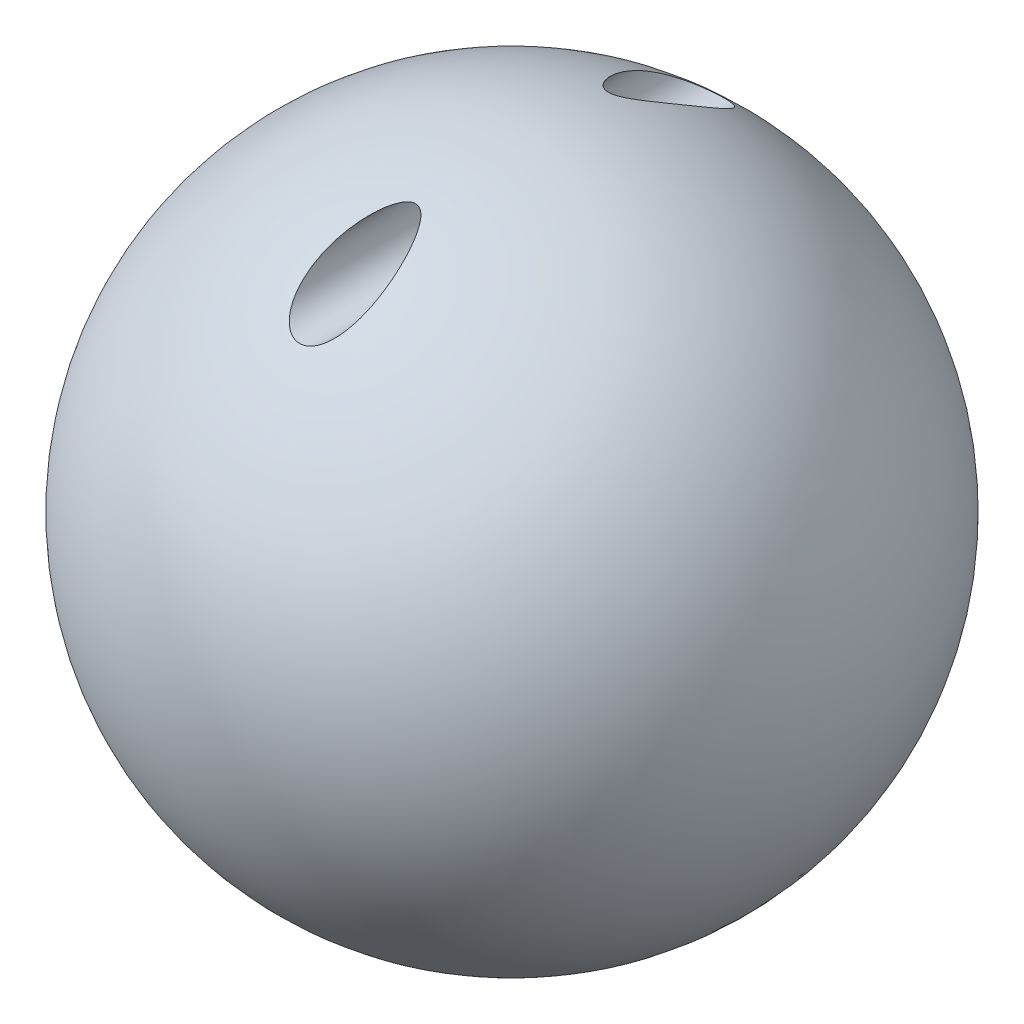
ISO-10303-21;
HEADER;
FILE_DESCRIPTION(('STEP AP214'),'2;1');
FILE_NAME('part.step','',(''),(''),'','','');
FILE_SCHEMA(('AUTOMOTIVE_DESIGN { 1 0 10303 214 1 1 1 1 }'));
ENDSEC;
DATA;
#1=APPLICATION_CONTEXT('core data for automotive mechanical design processes');
#2=APPLICATION_PROTOCOL_DEFINITION('international standard','automotive_design',2000,#1);
#3=PRODUCT_CONTEXT('',#1,'mechanical');
#4=PRODUCT('Part','Part','',(#3));
#5=PRODUCT_RELATED_PRODUCT_CATEGORY('part','',(#4));
#6=PRODUCT_DEFINITION_FORMATION('','',#4);
#7=PRODUCT_DEFINITION_CONTEXT('part definition',#1,'design');
#8=PRODUCT_DEFINITION('design','',#6,#7);
#9=PRODUCT_DEFINITION_SHAPE('','',#8);
#10=(LENGTH_UNIT() NAMED_UNIT(*) SI_UNIT(.MILLI.,.METRE.));
#11=(NAMED_UNIT(*) PLANE_ANGLE_UNIT() SI_UNIT($,.RADIAN.));
#12=(NAMED_UNIT(*) SI_UNIT($,.STERADIAN.) SOLID_ANGLE_UNIT());
#13=UNCERTAINTY_MEASURE_WITH_UNIT(LENGTH_MEASURE(1.E-05),#10,'distance_accuracy_value','');
#14=(GEOMETRIC_REPRESENTATION_CONTEXT(3) GLOBAL_UNCERTAINTY_ASSIGNED_CONTEXT((#13)) GLOBAL_UNIT_ASSIGNED_CONTEXT((#10,
#11,#12)) REPRESENTATION_CONTEXT('',''));
#15=CARTESIAN_POINT('',(0.,0.,0.));
#16=DIRECTION('',(0.,0.,1.));
#17=DIRECTION('',(1.,0.,0.));
#18=AXIS2_PLACEMENT_3D('',#15,#16,#17);
#19=CARTESIAN_POINT('',(0.,25.4,0.));
#20=DIRECTION('',(0.,-1.,0.));
#21=DIRECTION('',(-1.,0.,0.));
#22=AXIS2_PLACEMENT_3D('',#19,#20,#21);
#23=SPHERICAL_SURFACE('',#22,25.4);
#24=CARTESIAN_POINT('',(-1.22120269188826,45.1554710676395,-15.9182280292139));
#25=CARTESIAN_POINT('',(-1.29504889668407,45.1983675774323,-15.8593255572624));
#26=CARTESIAN_POINT('',(-1.36432660117678,45.2438049576575,-15.7966059746381));
#27=CARTESIAN_POINT('',(-1.49438026852856,45.3383211899476,-15.6652794467856));
#28=CARTESIAN_POINT('',(-1.55514590362782,45.3874043569072,-15.5966655098914));
#29=CARTESIAN_POINT('',(-1.66906555937857,45.4883022533573,-15.4546178828212));
#30=CARTESIAN_POINT('',(-1.72218262271763,45.5401286926444,-15.3811631369449));
#31=CARTESIAN_POINT('',(-1.82116586845447,45.645458786848,-15.2307463985294));
#32=CARTESIAN_POINT('',(-1.86703404513156,45.6989619755942,-15.1537853781523));
#33=CARTESIAN_POINT('',(-1.9720866919638,45.8322748420578,-14.9604946034897));
#34=CARTESIAN_POINT('',(-2.02750103824165,45.9127128211485,-14.8425480282001));
#35=CARTESIAN_POINT('',(-2.12601795824936,46.0745630331928,-14.6022577564816));
#36=CARTESIAN_POINT('',(-2.16911335116,46.1559758056738,-14.4799115420506));
#37=CARTESIAN_POINT('',(-2.24439906835192,46.3188021641079,-14.2319986921626));
#38=CARTESIAN_POINT('',(-2.27659266077261,46.4002157424875,-14.1064330339936));
#39=CARTESIAN_POINT('',(-2.33125908783958,46.5624348019014,-13.8527980240079));
#40=CARTESIAN_POINT('',(-2.35372857532033,46.6432400641559,-13.7247278259247));
#41=CARTESIAN_POINT('',(-2.40191695443047,46.8571282661932,-13.3808565723523));
#42=CARTESIAN_POINT('',(-2.41986172218042,46.9892450521534,-13.1633454046797));
#43=CARTESIAN_POINT('',(-2.43469593963043,47.2489258933365,-12.7248483331901));
#44=CARTESIAN_POINT('',(-2.4315706061623,47.3764866888974,-12.5038600982772));
#45=CARTESIAN_POINT('',(-2.40644783607022,47.6260661407181,-12.059688116764));
#46=CARTESIAN_POINT('',(-2.38443862318272,47.7480812886246,-11.8365030860808));
#47=CARTESIAN_POINT('',(-2.32294421402245,47.985692518625,-11.3892696316426));
#48=CARTESIAN_POINT('',(-2.28346663849183,48.1012913751653,-11.1652216265741));
#49=CARTESIAN_POINT('',(-2.19486719029323,48.3085458630019,-10.7511823132299));
#50=CARTESIAN_POINT('',(-2.14810986112904,48.401177005549,-10.5611696482777));
#51=CARTESIAN_POINT('',(-2.04218493685947,48.5811176842406,-10.181951783019));
#52=CARTESIAN_POINT('',(-1.98301115211364,48.6684245380895,-9.99274703364116));
#53=CARTESIAN_POINT('',(-1.85106479763699,48.8376455819365,-9.61548787612441));
#54=CARTESIAN_POINT('',(-1.7782331989098,48.9195341937289,-9.42744226580852));
#55=CARTESIAN_POINT('',(-1.65731027262432,49.0374636625934,-9.14852128112572));
#56=CARTESIAN_POINT('',(-1.61508030006588,49.0759385578975,-9.05611678182935));
#57=CARTESIAN_POINT('',(-1.52622146493736,49.1511476293938,-8.87273479931996));
#58=CARTESIAN_POINT('',(-1.47959354901758,49.187882177647,-8.78175701390377));
#59=CARTESIAN_POINT('',(-1.38072133274995,49.2598243878709,-8.60083943262291));
#60=CARTESIAN_POINT('',(-1.32842218095334,49.2950114590355,-8.51092122046047));
#61=CARTESIAN_POINT('',(-1.21759683436368,49.3631249911192,-8.3341541046464));
#62=CARTESIAN_POINT('',(-1.15907499550929,49.3960530071781,-8.24730310991118));
#63=CARTESIAN_POINT('',(-1.0348548959658,49.4588388701759,-8.07917965150705));
#64=CARTESIAN_POINT('',(-0.969237820654906,49.4887251481106,-7.99785846574072));
#65=CARTESIAN_POINT('',(-0.828178131340216,49.5448436955648,-7.84297904208908));
#66=CARTESIAN_POINT('',(-0.752773015310103,49.5710891573712,-7.76939302437336));
#67=CARTESIAN_POINT('',(-0.624530510750844,49.6078947605906,-7.66495625421325));
#68=CARTESIAN_POINT('',(-0.576095104859971,49.6203199374909,-7.62941549771759));
#69=CARTESIAN_POINT('',(-0.474533041788093,49.6427932735482,-7.56475570102212));
#70=CARTESIAN_POINT('',(-0.421411292105173,49.6528438796909,-7.5356300521958));
#71=CARTESIAN_POINT('',(-0.321869341961114,49.667998785212,-7.49152922923284));
#72=CARTESIAN_POINT('',(-0.27629517785285,49.673694002484,-7.47487908311355));
#73=CARTESIAN_POINT('',(-0.182858345756239,49.6825527302927,-7.44893012503085));
#74=CARTESIAN_POINT('',(-0.134998774683771,49.6857195692925,-7.43962164838231));
#75=CARTESIAN_POINT('',(-0.0379459782363398,49.6891776198824,-7.4294554329896));
#76=CARTESIAN_POINT('',(0.011253764962471,49.6894505279959,-7.42865148358754));
#77=CARTESIAN_POINT('',(0.108946958741016,49.6870373034312,-7.43574832779594));
#78=CARTESIAN_POINT('',(0.157439968731873,49.6843493987054,-7.44365433431923));
#79=CARTESIAN_POINT('',(0.259165601034126,49.6757496577907,-7.46886624630423));
#80=CARTESIAN_POINT('',(0.312057584884285,49.669424696368,-7.48737521774072));
#81=CARTESIAN_POINT('',(0.413997006076599,49.6540369912092,-7.53216241287146));
#82=CARTESIAN_POINT('',(0.463036372319774,49.6449686833032,-7.55845642417788));
#83=CARTESIAN_POINT('',(0.588328260023335,49.6180904182304,-7.63588162182169));
#84=CARTESIAN_POINT('',(0.661102094748359,49.5984678447894,-7.69193114085682));
#85=CARTESIAN_POINT('',(0.797555671820042,49.5555629615163,-7.81290754392359));
#86=CARTESIAN_POINT('',(0.861205859485695,49.5322692493139,-7.87786200160615));
#87=CARTESIAN_POINT('',(1.00352611864591,49.4740000120589,-8.03815404512306));
#88=CARTESIAN_POINT('',(1.0790448654258,49.4378902548852,-8.13584389434245));
#89=CARTESIAN_POINT('',(1.2202071666398,49.3621272019926,-8.33691435724271));
#90=CARTESIAN_POINT('',(1.28583084520859,49.3224670226347,-8.44030586968699));
#91=CARTESIAN_POINT('',(1.409537218554,49.2400862830774,-8.65102213644459));
#92=CARTESIAN_POINT('',(1.46758282272023,49.1973521498687,-8.75836316500705));
#93=CARTESIAN_POINT('',(1.57710391411269,49.1093919269346,-8.97519682514374));
#94=CARTESIAN_POINT('',(1.62858444719563,49.064167789753,-9.08468772873135));
#95=CARTESIAN_POINT('',(1.72747265486101,48.9699304714869,-9.30870399425501));
#96=CARTESIAN_POINT('',(1.77469720016961,48.9208423405947,-9.42327831827325));
#97=CARTESIAN_POINT('',(1.86376412091584,48.8203741893429,-9.65350835872789));
#98=CARTESIAN_POINT('',(1.90560584501294,48.7689938926343,-9.76916420421936));
#99=CARTESIAN_POINT('',(2.0237461060954,48.6115019442542,-10.1173987629656));
#100=CARTESIAN_POINT('',(2.09258244811132,48.5021146641757,-10.3510648675204));
#101=CARTESIAN_POINT('',(2.21163494383639,48.2755433545962,-10.8189298363516));
#102=CARTESIAN_POINT('',(2.26187263165345,48.1583685284285,-11.0531277666146));
#103=CARTESIAN_POINT('',(2.34369553806602,47.9167425448229,-11.5210401946848));
#104=CARTESIAN_POINT('',(2.37528261947513,47.7922921154336,-11.7547547384481));
#105=CARTESIAN_POINT('',(2.41432793245391,47.5622192898741,-12.174263804982));
#106=CARTESIAN_POINT('',(2.42532906200345,47.4577576831846,-12.3603696010756));
#107=CARTESIAN_POINT('',(2.43353230212958,47.2451152143564,-12.7308483365441));
#108=CARTESIAN_POINT('',(2.43073110534832,47.1369334669531,-12.9152208499791));
#109=CARTESIAN_POINT('',(2.40986655518239,46.9178545361395,-13.2808080383157));
#110=CARTESIAN_POINT('',(2.39184677358343,46.8069659817454,-13.4620302226446));
#111=CARTESIAN_POINT('',(2.33861635579389,46.5832080512829,-13.820561195583));
#112=CARTESIAN_POINT('',(2.30341786898063,46.4703401293989,-13.997872657498));
#113=CARTESIAN_POINT('',(2.21244774518542,46.242217745683,-14.3496926416782));
#114=CARTESIAN_POINT('',(2.15638047692263,46.1269526302659,-14.524121312024));
#115=CARTESIAN_POINT('',(2.05404941898932,45.9553636914838,-14.7793641480757));
#116=CARTESIAN_POINT('',(2.01688577149094,45.8983673225157,-14.863404480225));
#117=CARTESIAN_POINT('',(1.93585864492449,45.7852696137902,-15.0288025718364));
#118=CARTESIAN_POINT('',(1.89199645176243,45.7291681045266,-15.1101608425313));
#119=CARTESIAN_POINT('',(1.76894729815784,45.5858639105069,-15.3163686120847));
#120=CARTESIAN_POINT('',(1.6841402571277,45.499739988214,-15.4387074714779));
#121=CARTESIAN_POINT('',(1.49283439482507,45.3346640448776,-15.670669351584));
#122=CARTESIAN_POINT('',(1.38638661890859,45.2556957676511,-15.7803213597353));
#123=CARTESIAN_POINT('',(1.19208825313496,45.1369805128223,-15.9437275743785));
#124=CARTESIAN_POINT('',(1.11152222325139,45.0934044977162,-16.0033203818185));
#125=CARTESIAN_POINT('',(0.940139848893022,45.0136585050145,-16.1118704310498));
#126=CARTESIAN_POINT('',(0.849337147415561,44.9774788467464,-16.1608415801155));
#127=CARTESIAN_POINT('',(0.675027625332358,44.9206346797621,-16.237525534873));
#128=CARTESIAN_POINT('',(0.593035336024048,44.8983618098928,-16.2674605598628));
#129=CARTESIAN_POINT('',(0.423964079561186,44.8622096381516,-16.3159644392995));
#130=CARTESIAN_POINT('',(0.336889051885857,44.8483239279353,-16.3345419717537));
#131=CARTESIAN_POINT('',(0.159451645104566,44.8301026579971,-16.3589067962363));
#132=CARTESIAN_POINT('',(0.0690739535567555,44.8258194873709,-16.3646239256325));
#133=CARTESIAN_POINT('',(-0.111434349381282,44.827393117231,-16.3625219306536));
#134=CARTESIAN_POINT('',(-0.201564968216669,44.833249608734,-16.354703218753));
#135=CARTESIAN_POINT('',(-0.370962493499667,44.8535963147779,-16.3274858851114));
#136=CARTESIAN_POINT('',(-0.450499224284011,44.8673052251067,-16.309134915942));
#137=CARTESIAN_POINT('',(-0.605158407773694,44.9016991941075,-16.2629740354465));
#138=CARTESIAN_POINT('',(-0.680279539896226,44.9223863274319,-16.2351613110833));
#139=CARTESIAN_POINT('',(-0.838790898967641,44.9739939233232,-16.1655442296868));
#140=CARTESIAN_POINT('',(-0.921058163971483,45.0061098096742,-16.1220885349436));
#141=CARTESIAN_POINT('',(-1.07732049717863,45.0765449789807,-16.0263098003649));
#142=CARTESIAN_POINT('',(-1.1513079287967,45.1148699101702,-15.9739786847004));
#143=CARTESIAN_POINT('',(-1.22120269188826,45.1554710676395,-15.9182280292139));
#144=B_SPLINE_CURVE_WITH_KNOTS('',3,(#24,#25,#26,#27,#28,#29,#30,#31,#32,#33,#34,#35,#36,#37,
#38,#39,#40,#41,#42,#43,#44,#45,#46,#47,#48,#49,#50,#51,#52,#53,#54,#55,#56,#57,#58,#59,#60,#61,
#62,#63,#64,#65,#66,#67,#68,#69,#70,#71,#72,#73,#74,#75,#76,#77,#78,#79,#80,#81,#82,#83,#84,#85,
#86,#87,#88,#89,#90,#91,#92,#93,#94,#95,#96,#97,#98,#99,#100,#101,#102,#103,#104,#105,#106,#107,
#108,#109,#110,#111,#112,#113,#114,#115,#116,#117,#118,#119,#120,#121,#122,#123,#124,#125,#126,
#127,#128,#129,#130,#131,#132,#133,#134,#135,#136,#137,#138,#139,#140,#141,#142,#143),
.UNSPECIFIED.,.T.,.F.,(4,2,2,2,2,2,2,2,2,2,2,2,2,2,2,2,2,2,2,2,2,2,2,2,2,2,2,2,2,2,2,2,2,2,2,2,
2,2,2,2,2,2,2,2,2,2,2,2,2,2,2,2,2,2,2,2,2,2,2,4),(0.,0.311044942299069,0.622464068266117,
0.93534078967686,1.24813128351779,1.70684107837943,2.16581771622929,2.62465664010305,
3.08365337702596,3.84785551720727,4.6125938913537,5.37780951445301,6.14269163346435,
6.79178853742221,7.44120979016114,8.0935053792522,8.41933343160224,8.74509150934497,
9.07434186984746,9.40336325072643,9.72895415304777,10.0533326281337,10.2369810061336,
10.4204393016315,10.566442252653,10.7122526808742,10.8589847820404,11.0058047501715,
11.1740439793527,11.3426267525394,11.6228228863174,11.9039070984836,12.2889483935321,
12.6747530891335,13.0623804458809,13.4497080566068,13.849434447537,14.2492091613799,
15.0493853833599,15.8486322169091,16.6477992085591,17.288474688091,17.9293036958078,
18.5683041645073,19.206853363318,19.8548157755088,20.1790062488332,20.5031345660278,
21.0175663990192,21.5307986020181,21.8576503858492,22.1840715936626,22.453229628003,
22.7221817468042,22.9925976678858,23.2630053487941,23.5102845159113,23.757637264963,
24.0517693981071,24.3461706149731),.UNSPECIFIED.);
#145=CARTESIAN_POINT('',(-1.22120269188826,45.1554710676395,-15.9182280292139));
#146=VERTEX_POINT('',#145);
#147=EDGE_CURVE('E10',#146,#146,#144,.T.);
#148=ORIENTED_EDGE('',*,*,#147,.F.);
#149=EDGE_LOOP('',(#148));
#150=FACE_BOUND('',#149,.T.);
#151=CARTESIAN_POINT('',(-0.770807223783634,49.5635619689032,7.79025860923351));
#152=CARTESIAN_POINT('',(-0.843850258609351,49.5391484846441,7.85875585819866));
#153=CARTESIAN_POINT('',(-0.9116547217483,49.5126667317835,7.93213719300245));
#154=CARTESIAN_POINT('',(-1.03921002263264,49.4567951972926,8.0846372760782));
#155=CARTESIAN_POINT('',(-1.09894104719451,49.4273985577605,8.16376943181876));
#156=CARTESIAN_POINT('',(-1.21244082043118,49.3660873999847,8.3263130450756));
#157=CARTESIAN_POINT('',(-1.26615578097366,49.3341539541118,8.40975464879257));
#158=CARTESIAN_POINT('',(-1.36826184832095,49.268336777508,8.57911593215942));
#159=CARTESIAN_POINT('',(-1.4166501792464,49.234452043776,8.66503687471265));
#160=CARTESIAN_POINT('',(-1.50915782957892,49.1647699722041,8.83906868052958));
#161=CARTESIAN_POINT('',(-1.55325178813746,49.1289630065147,8.92718909675709));
#162=CARTESIAN_POINT('',(-1.63743835979751,49.0557528641811,9.10467709181579));
#163=CARTESIAN_POINT('',(-1.67753023645956,49.018349395559,9.19404489674813));
#164=CARTESIAN_POINT('',(-1.7924930023033,48.9038427630988,9.46363320215869));
#165=CARTESIAN_POINT('',(-1.86198481089488,48.8244945852418,9.64521040337869));
#166=CARTESIAN_POINT('',(-1.98840074317085,48.6605472436447,10.0098500290161));
#167=CARTESIAN_POINT('',(-2.04534753624294,48.575957911402,10.1929091442717));
#168=CARTESIAN_POINT('',(-2.14762135754697,48.4017887007444,10.5597950094329));
#169=CARTESIAN_POINT('',(-2.19295282953585,48.312210746877,10.7436214383453));
#170=CARTESIAN_POINT('',(-2.28031841083198,48.1095709066953,11.148950550363));
#171=CARTESIAN_POINT('',(-2.31978850016348,47.9954490808417,11.3704807678764));
#172=CARTESIAN_POINT('',(-2.38168866255755,47.7609202816858,11.8127236332009));
#173=CARTESIAN_POINT('',(-2.40411154949588,47.6405106806487,12.0334358972401));
#174=CARTESIAN_POINT('',(-2.43053014362545,47.3944917486157,12.4722940523149));
#175=CARTESIAN_POINT('',(-2.43457731928725,47.2688979363339,12.6904454023103));
#176=CARTESIAN_POINT('',(-2.42229301105282,47.0132521570225,13.1233771344348));
#177=CARTESIAN_POINT('',(-2.40597669572939,46.8832035784534,13.3381599051687));
#178=CARTESIAN_POINT('',(-2.35076815705844,46.6238156370312,13.7565618569543));
#179=CARTESIAN_POINT('',(-2.31256077713988,46.4945699090822,13.9603231425071));
#180=CARTESIAN_POINT('',(-2.23568620766392,46.2998963716894,14.2608212092618));
#181=CARTESIAN_POINT('',(-2.20674128431213,46.2347705375748,14.3602784793055));
#182=CARTESIAN_POINT('',(-2.14165283022086,46.104699441094,14.5569119534863));
#183=CARTESIAN_POINT('',(-2.10551166187647,46.0397541265423,14.6540888945412));
#184=CARTESIAN_POINT('',(-2.02466935553693,45.9095729695035,14.8470040958226));
#185=CARTESIAN_POINT('',(-1.97984928327074,45.8443470883889,14.9426996839279));
#186=CARTESIAN_POINT('',(-1.88102972801596,45.7152689708862,15.1303332854077));
#187=CARTESIAN_POINT('',(-1.82702588078258,45.6514174039174,15.222269486388));
#188=CARTESIAN_POINT('',(-1.70906240729188,45.5264613314,15.4006465878546));
#189=CARTESIAN_POINT('',(-1.64515687287575,45.4653440975503,15.4871139489982));
#190=CARTESIAN_POINT('',(-1.50606890378184,45.3469935558507,15.6532555366094));
#191=CARTESIAN_POINT('',(-1.43090369458972,45.2897545059674,15.7329398529709));
#192=CARTESIAN_POINT('',(-1.27833146881846,45.1879450644247,15.8737120046244));
#193=CARTESIAN_POINT('',(-1.20239407746805,45.1426866423591,15.9358783539106));
#194=CARTESIAN_POINT('',(-1.04044523786256,45.0584992840069,16.0509348572731));
#195=CARTESIAN_POINT('',(-0.954432334166824,45.0195712641121,16.1038236684159));
#196=CARTESIAN_POINT('',(-0.771458464417335,44.9500585549792,16.1979007803379));
#197=CARTESIAN_POINT('',(-0.674377063262407,44.9195811029959,16.2389389457957));
#198=CARTESIAN_POINT('',(-0.472047674331792,44.8705253749593,16.3048363007679));
#199=CARTESIAN_POINT('',(-0.36681607663947,44.8519238789594,16.3297270633362));
#200=CARTESIAN_POINT('',(-0.166122001130838,44.8303778504418,16.3585397708272));
#201=CARTESIAN_POINT('',(-0.0711795280549214,44.8257051929721,16.3647765005064));
#202=CARTESIAN_POINT('',(0.118395423048613,44.8275521367519,16.3623096138246));
#203=CARTESIAN_POINT('',(0.213027973708155,44.8340688946788,16.3536097929643));
#204=CARTESIAN_POINT('',(0.386561421338774,44.8560542798817,16.3241954660306));
#205=CARTESIAN_POINT('',(0.465922960602853,44.8702671195454,16.3051656389821));
#206=CARTESIAN_POINT('',(0.62013255738557,44.9056003253055,16.2577310432504));
#207=CARTESIAN_POINT('',(0.69497944755261,44.9267224689474,16.2293238620533));
#208=CARTESIAN_POINT('',(0.870657913013905,44.9851365835736,16.1504930561478));
#209=CARTESIAN_POINT('',(0.968592928677343,45.0254634908385,16.0958701985374));
#210=CARTESIAN_POINT('',(1.15236505013333,45.1145169416225,15.974481797909));
#211=CARTESIAN_POINT('',(1.23817321771998,45.1632629801841,15.9076880522125));
#212=CARTESIAN_POINT('',(1.43958088715625,45.293207508801,15.7283314771631));
#213=CARTESIAN_POINT('',(1.5475780704398,45.3781336316551,15.6099865285072));
#214=CARTESIAN_POINT('',(1.74027201428513,45.5549541327853,15.3604075421555));
#215=CARTESIAN_POINT('',(1.82491860610061,45.6468629817328,15.2291465621451));
#216=CARTESIAN_POINT('',(1.96266488691466,45.8193401857743,14.9793776008972));
#217=CARTESIAN_POINT('',(2.01862796468916,45.8994340495213,14.8620857648017));
#218=CARTESIAN_POINT('',(2.11823662752806,46.0606816949766,14.6230159527576));
#219=CARTESIAN_POINT('',(2.16187385982036,46.1418361566326,14.5012349975779));
#220=CARTESIAN_POINT('',(2.23829208319366,46.30432145826,14.2542183223506));
#221=CARTESIAN_POINT('',(2.27105808951139,46.3856523874253,14.1289780893699));
#222=CARTESIAN_POINT('',(2.32683054731236,46.5477416745896,13.8759594202328));
#223=CARTESIAN_POINT('',(2.34983374525555,46.6284998329052,13.7481801527488));
#224=CARTESIAN_POINT('',(2.39927329033447,46.8417339305667,13.4059579637515));
#225=CARTESIAN_POINT('',(2.41801195642426,46.9732806150264,13.1898054869748));
#226=CARTESIAN_POINT('',(2.43455000218492,47.2319229565098,12.753998118883));
#227=CARTESIAN_POINT('',(2.43233465034541,47.3590154190226,12.5343408719002));
#228=CARTESIAN_POINT('',(2.40914134036484,47.6078747652069,12.0925940127675));
#229=CARTESIAN_POINT('',(2.38813432968511,47.7296330962645,11.8705011604362));
#230=CARTESIAN_POINT('',(2.32874855635568,47.9668241496227,11.4254028288314));
#231=CARTESIAN_POINT('',(2.29037704094382,48.0822594883738,11.2023977687154));
#232=CARTESIAN_POINT('',(2.20286212145535,48.2919199393713,10.7850083111531));
#233=CARTESIAN_POINT('',(2.15572614681341,48.3869686887656,10.5906141129852));
#234=CARTESIAN_POINT('',(2.04849628244891,48.5715131487016,10.2026316233814));
#235=CARTESIAN_POINT('',(1.98839601998961,48.6610061002689,10.0090437761912));
#236=CARTESIAN_POINT('',(1.85433077342023,48.8339398596558,9.62397618035329));
#237=CARTESIAN_POINT('',(1.78037064290665,48.9173827719985,9.43249571849598));
#238=CARTESIAN_POINT('',(1.65733455008014,49.0374727968177,9.1485169654293));
#239=CARTESIAN_POINT('',(1.61432742033899,49.0766414810336,9.05443707598987));
#240=CARTESIAN_POINT('',(1.52374839726385,49.1531725837516,8.86776195093566));
#241=CARTESIAN_POINT('',(1.47617766226789,49.1905354570044,8.7751663455061));
#242=CARTESIAN_POINT('',(1.38423272544741,49.2571157035416,8.60757626329237));
#243=CARTESIAN_POINT('',(1.34067990708506,49.2866415246316,8.53225493591239));
#244=CARTESIAN_POINT('',(1.24927285444272,49.3441706438203,8.38358237737999));
#245=CARTESIAN_POINT('',(1.20141636478347,49.3721731311197,8.3102322056901));
#246=CARTESIAN_POINT('',(1.1008631631364,49.4262182869551,8.16684066888934));
#247=CARTESIAN_POINT('',(1.04819623221641,49.4522714100853,8.09678253563778));
#248=CARTESIAN_POINT('',(0.936657972907817,49.5021478159247,7.96099635291311));
#249=CARTESIAN_POINT('',(0.877795632799991,49.5259742368424,7.89526224929265));
#250=CARTESIAN_POINT('',(0.772361554703559,49.5634842986753,7.79059223061924));
#251=CARTESIAN_POINT('',(0.727908179427043,49.5779689947285,7.74982644542826));
#252=CARTESIAN_POINT('',(0.634668981944789,49.6051893089004,7.67266933323442));
#253=CARTESIAN_POINT('',(0.585876883615427,49.6179223230882,7.63628452850458));
#254=CARTESIAN_POINT('',(0.482843665764908,49.6411509665858,7.56950558285556));
#255=CARTESIAN_POINT('',(0.42854180561025,49.6516164868395,7.53919242133041));
#256=CARTESIAN_POINT('',(0.315100970716225,49.6691562885888,7.48816945094081));
#257=CARTESIAN_POINT('',(0.255979234267003,49.6762420840884,7.46742704454404));
#258=CARTESIAN_POINT('',(0.151339739226133,49.6846711503201,7.4427070856874));
#259=CARTESIAN_POINT('',(0.106636321974764,49.6870657336692,7.43566467778499));
#260=CARTESIAN_POINT('',(0.0166215246663891,49.6893455406684,7.42896028788732));
#261=CARTESIAN_POINT('',(-0.0286894028584533,49.6892325385736,7.42929308752532));
#262=CARTESIAN_POINT('',(-0.118473603693766,49.6865137460983,7.43728741845872));
#263=CARTESIAN_POINT('',(-0.162948314745302,49.6839127290658,7.44493491623528));
#264=CARTESIAN_POINT('',(-0.250103765422716,49.6764855025933,7.46670857502904));
#265=CARTESIAN_POINT('',(-0.29278177773071,49.6716560345685,7.48084422327808));
#266=CARTESIAN_POINT('',(-0.396854191253373,49.6572118462132,7.52295226135091));
#267=CARTESIAN_POINT('',(-0.456699687116902,49.6464127564599,7.55430485378658));
#268=CARTESIAN_POINT('',(-0.570571731228091,49.6218090111584,7.62516128213262));
#269=CARTESIAN_POINT('',(-0.624588656060823,49.6079994953424,7.6646782938671));
#270=CARTESIAN_POINT('',(-0.69231594453748,49.5883932065468,7.7202850644555));
#271=CARTESIAN_POINT('',(-0.708374425255043,49.5835601947695,7.73395693557088));
#272=CARTESIAN_POINT('',(-0.739967057460304,49.5737021279237,7.76176788185972));
#273=CARTESIAN_POINT('',(-0.755502140315293,49.5686774520596,7.77590602770038));
#274=CARTESIAN_POINT('',(-0.770807223783634,49.5635619689032,7.79025860923351));
#275=B_SPLINE_CURVE_WITH_KNOTS('',3,(#151,#152,#153,#154,#155,#156,#157,#158,#159,#160,#161,
#162,#163,#164,#165,#166,#167,#168,#169,#170,#171,#172,#173,#174,#175,#176,#177,#178,#179,#180,
#181,#182,#183,#184,#185,#186,#187,#188,#189,#190,#191,#192,#193,#194,#195,#196,#197,#198,#199,
#200,#201,#202,#203,#204,#205,#206,#207,#208,#209,#210,#211,#212,#213,#214,#215,#216,#217,#218,
#219,#220,#221,#222,#223,#224,#225,#226,#227,#228,#229,#230,#231,#232,#233,#234,#235,#236,#237,
#238,#239,#240,#241,#242,#243,#244,#245,#246,#247,#248,#249,#250,#251,#252,#253,#254,#255,#256,
#257,#258,#259,#260,#261,#262,#263,#264,#265,#266,#267,#268,#269,#270,#271,#272,#273,#274),
.UNSPECIFIED.,.T.,.F.,(4,2,2,2,2,2,2,2,2,2,2,2,2,2,2,2,2,2,2,2,2,2,2,2,2,2,2,2,2,2,2,2,2,2,2,2,
2,2,2,2,2,2,2,2,2,2,2,2,2,2,2,2,2,2,2,2,2,2,2,2,2,4),(0.,0.309174873414087,0.619095232035015,
0.931596234034525,1.24425932707488,1.55866923372971,1.87313688999493,2.50253022046712,
3.13077670650847,3.75878247968863,4.5150409416904,5.27161802245616,6.02607469637333,
6.77996971788356,7.51147577021832,7.87835582300724,8.24511563379377,8.61731147597233,
8.98968468707108,9.3600910676281,9.72993646644908,10.0532890985708,10.3766884977706,
10.7040213470617,11.030712217039,11.3147191253964,11.5986538759378,11.8461600347891,
12.0937299192962,12.4492263304818,12.8055572317421,13.3465268414673,13.888649829183,
14.3459858432891,14.8036310376946,15.2619044489587,15.7203304640933,16.4803518846016,
17.2409076701766,18.0026413367595,18.7640573794862,19.4280140625114,20.0922978674496,
20.7563494796418,21.0880928827089,21.4197523040637,21.6952859179889,21.9709647788522,
22.245039701586,22.5187223394955,22.7045699014314,22.8906908134711,23.0791493185175,
23.2669611167511,23.4022983735961,23.5375398749154,23.6725224297702,23.8077029933902,
24.0117913794479,24.2162117347877,24.2811170950051,24.3459000993696),.UNSPECIFIED.);
#276=CARTESIAN_POINT('',(-0.770807223783634,49.5635619689032,7.79025860923351));
#277=VERTEX_POINT('',#276);
#278=EDGE_CURVE('E54',#277,#277,#275,.T.);
#279=ORIENTED_EDGE('',*,*,#278,.F.);
#280=EDGE_LOOP('',(#279));
#281=FACE_BOUND('',#280,.T.);
#282=ADVANCED_FACE('F43',(#150,#281),#23,.T.);
#283=CARTESIAN_POINT('',(0.,47.2577504573154,-25.4));
#284=DIRECTION('',(0.,0.,1.));
#285=DIRECTION('',(1.,0.,0.));
#286=AXIS2_PLACEMENT_3D('',#283,#284,#285);
#287=CYLINDRICAL_SURFACE('',#286,2.43123641450353);
#288=ORIENTED_EDGE('',*,*,#147,.T.);
#289=EDGE_LOOP('',(#288));
#290=FACE_BOUND('',#289,.T.);
#291=ORIENTED_EDGE('',*,*,#278,.T.);
#292=EDGE_LOOP('',(#291));
#293=FACE_BOUND('',#292,.T.);
#294=ADVANCED_FACE('F64',(#290,#293),#287,.F.);
#295=CLOSED_SHELL('',(#282,#294));
#296=MANIFOLD_SOLID_BREP('B2',#295);
#297=ADVANCED_BREP_SHAPE_REPRESENTATION('',(#18,#296),#14);
#298=SHAPE_DEFINITION_REPRESENTATION(#9,#297);
ENDSEC;
END-ISO-10303-21;
